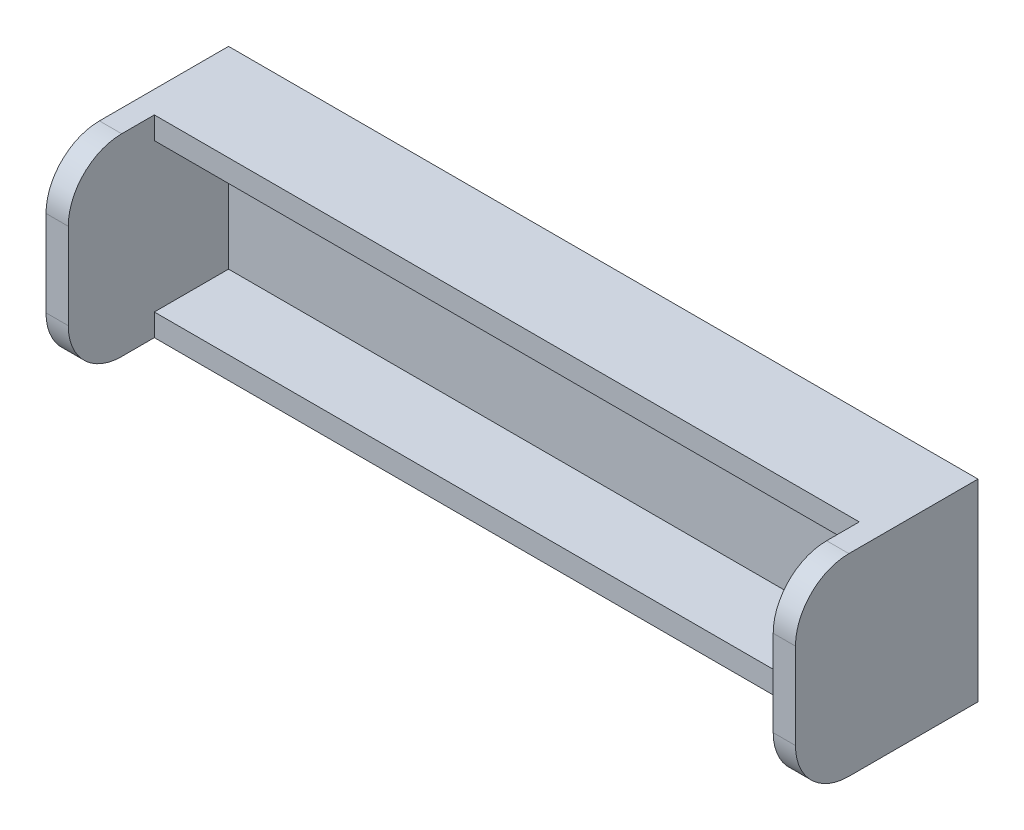
ISO-10303-21;
HEADER;
FILE_DESCRIPTION(('STEP AP214'),'2;1');
FILE_NAME('part.step','',(''),(''),'','','');
FILE_SCHEMA(('AUTOMOTIVE_DESIGN { 1 0 10303 214 1 1 1 1 }'));
ENDSEC;
DATA;
#1=APPLICATION_CONTEXT('core data for automotive mechanical design processes');
#2=APPLICATION_PROTOCOL_DEFINITION('international standard','automotive_design',2000,#1);
#3=PRODUCT_CONTEXT('',#1,'mechanical');
#4=PRODUCT('Part','Part','',(#3));
#5=PRODUCT_RELATED_PRODUCT_CATEGORY('part','',(#4));
#6=PRODUCT_DEFINITION_FORMATION('','',#4);
#7=PRODUCT_DEFINITION_CONTEXT('part definition',#1,'design');
#8=PRODUCT_DEFINITION('design','',#6,#7);
#9=PRODUCT_DEFINITION_SHAPE('','',#8);
#10=(LENGTH_UNIT() NAMED_UNIT(*) SI_UNIT(.MILLI.,.METRE.));
#11=(NAMED_UNIT(*) PLANE_ANGLE_UNIT() SI_UNIT($,.RADIAN.));
#12=(NAMED_UNIT(*) SI_UNIT($,.STERADIAN.) SOLID_ANGLE_UNIT());
#13=UNCERTAINTY_MEASURE_WITH_UNIT(LENGTH_MEASURE(1.E-05),#10,'distance_accuracy_value','');
#14=(GEOMETRIC_REPRESENTATION_CONTEXT(3) GLOBAL_UNCERTAINTY_ASSIGNED_CONTEXT((#13)) GLOBAL_UNIT_ASSIGNED_CONTEXT((#10,
#11,#12)) REPRESENTATION_CONTEXT('',''));
#15=CARTESIAN_POINT('',(0.,0.,0.));
#16=DIRECTION('',(0.,0.,1.));
#17=DIRECTION('',(1.,0.,0.));
#18=AXIS2_PLACEMENT_3D('',#15,#16,#17);
#19=CARTESIAN_POINT('',(0.,0.,1.5));
#20=DIRECTION('',(0.,0.,1.));
#21=DIRECTION('',(1.,0.,0.));
#22=AXIS2_PLACEMENT_3D('',#19,#20,#21);
#23=PLANE('',#22);
#24=DIRECTION('',(0.,1.,0.));
#25=VECTOR('',#24,1.);
#26=CARTESIAN_POINT('',(49.,0.,1.5));
#27=LINE('',#26,#25);
#28=CARTESIAN_POINT('',(49.,-5.,1.5));
#29=VERTEX_POINT('',#28);
#30=CARTESIAN_POINT('',(49.,5.,1.5));
#31=VERTEX_POINT('',#30);
#32=EDGE_CURVE('E206',#29,#31,#27,.T.);
#33=ORIENTED_EDGE('',*,*,#32,.T.);
#34=DIRECTION('',(-1.,0.,0.));
#35=VECTOR('',#34,1.);
#36=CARTESIAN_POINT('',(0.,5.,1.5));
#37=LINE('',#36,#35);
#38=CARTESIAN_POINT('',(1.5,5.,1.5));
#39=VERTEX_POINT('',#38);
#40=EDGE_CURVE('E217',#31,#39,#37,.T.);
#41=ORIENTED_EDGE('',*,*,#40,.T.);
#42=DIRECTION('',(0.,-1.,0.));
#43=VECTOR('',#42,1.);
#44=CARTESIAN_POINT('',(1.5,2.9,1.5));
#45=LINE('',#44,#43);
#46=CARTESIAN_POINT('',(1.5,-5.,1.5));
#47=VERTEX_POINT('',#46);
#48=EDGE_CURVE('E176',#39,#47,#45,.T.);
#49=ORIENTED_EDGE('',*,*,#48,.T.);
#50=DIRECTION('',(1.,0.,0.));
#51=VECTOR('',#50,1.);
#52=CARTESIAN_POINT('',(0.,-5.,1.5));
#53=LINE('',#52,#51);
#54=EDGE_CURVE('E267',#47,#29,#53,.T.);
#55=ORIENTED_EDGE('',*,*,#54,.T.);
#56=EDGE_LOOP('',(#33,#41,#49,#55));
#57=FACE_BOUND('',#56,.T.);
#58=ADVANCED_FACE('F32',(#57),#23,.T.);
#59=CARTESIAN_POINT('',(1.5,2.9,8.69999999999999));
#60=DIRECTION('',(1.,0.,0.));
#61=DIRECTION('',(0.,0.,-1.));
#62=AXIS2_PLACEMENT_3D('',#59,#60,#61);
#63=PLANE('',#62);
#64=DIRECTION('',(0.,0.,1.));
#65=VECTOR('',#64,1.);
#66=CARTESIAN_POINT('',(1.5,5.,8.69999999999999));
#67=LINE('',#66,#65);
#68=CARTESIAN_POINT('',(1.5,5.,6.5));
#69=VERTEX_POINT('',#68);
#70=EDGE_CURVE('E163',#39,#69,#67,.T.);
#71=ORIENTED_EDGE('',*,*,#70,.T.);
#72=DIRECTION('',(0.,1.,0.));
#73=VECTOR('',#72,1.);
#74=CARTESIAN_POINT('',(1.5,2.9,6.5));
#75=LINE('',#74,#73);
#76=CARTESIAN_POINT('',(1.5,6.5,6.5));
#77=VERTEX_POINT('',#76);
#78=EDGE_CURVE('E154',#69,#77,#75,.T.);
#79=ORIENTED_EDGE('',*,*,#78,.T.);
#80=DIRECTION('',(0.,0.,1.));
#81=VECTOR('',#80,1.);
#82=CARTESIAN_POINT('',(1.5,6.5,0.));
#83=LINE('',#82,#81);
#84=CARTESIAN_POINT('',(1.5,6.5,8.69999999999999));
#85=VERTEX_POINT('',#84);
#86=EDGE_CURVE('E89',#77,#85,#83,.T.);
#87=ORIENTED_EDGE('',*,*,#86,.T.);
#88=CARTESIAN_POINT('',(1.5,2.9,8.69999999999999));
#89=DIRECTION('',(1.,0.,0.));
#90=DIRECTION('',(0.,0.,-1.));
#91=AXIS2_PLACEMENT_3D('',#88,#89,#90);
#92=CIRCLE('',#91,3.6);
#93=CARTESIAN_POINT('',(1.5,2.89999999999999,12.3));
#94=VERTEX_POINT('',#93);
#95=EDGE_CURVE('E169',#85,#94,#92,.T.);
#96=ORIENTED_EDGE('',*,*,#95,.T.);
#97=DIRECTION('',(0.,-1.,0.));
#98=VECTOR('',#97,1.);
#99=CARTESIAN_POINT('',(1.5,-2.9,12.3));
#100=LINE('',#99,#98);
#101=CARTESIAN_POINT('',(1.5,-2.9,12.3));
#102=VERTEX_POINT('',#101);
#103=EDGE_CURVE('E171',#94,#102,#100,.T.);
#104=ORIENTED_EDGE('',*,*,#103,.T.);
#105=CARTESIAN_POINT('',(1.5,-2.9,8.69999999999999));
#106=DIRECTION('',(1.,0.,0.));
#107=DIRECTION('',(0.,0.,1.));
#108=AXIS2_PLACEMENT_3D('',#105,#106,#107);
#109=CIRCLE('',#108,3.6);
#110=CARTESIAN_POINT('',(1.5,-6.5,8.69999999999999));
#111=VERTEX_POINT('',#110);
#112=EDGE_CURVE('E55',#102,#111,#109,.T.);
#113=ORIENTED_EDGE('',*,*,#112,.T.);
#114=DIRECTION('',(0.,0.,-1.));
#115=VECTOR('',#114,1.);
#116=CARTESIAN_POINT('',(1.5,-6.5,0.));
#117=LINE('',#116,#115);
#118=CARTESIAN_POINT('',(1.5,-6.5,6.5));
#119=VERTEX_POINT('',#118);
#120=EDGE_CURVE('E181',#111,#119,#117,.T.);
#121=ORIENTED_EDGE('',*,*,#120,.T.);
#122=DIRECTION('',(0.,-1.,0.));
#123=VECTOR('',#122,1.);
#124=CARTESIAN_POINT('',(1.5,2.9,6.5));
#125=LINE('',#124,#123);
#126=CARTESIAN_POINT('',(1.5,-5.,6.5));
#127=VERTEX_POINT('',#126);
#128=EDGE_CURVE('E228',#127,#119,#125,.T.);
#129=ORIENTED_EDGE('',*,*,#128,.F.);
#130=DIRECTION('',(0.,0.,-1.));
#131=VECTOR('',#130,1.);
#132=CARTESIAN_POINT('',(1.5,-5.,8.69999999999999));
#133=LINE('',#132,#131);
#134=EDGE_CURVE('E232',#127,#47,#133,.T.);
#135=ORIENTED_EDGE('',*,*,#134,.T.);
#136=ORIENTED_EDGE('',*,*,#48,.F.);
#137=EDGE_LOOP('',(#71,#79,#87,#96,#104,#113,#121,#129,#135,#136));
#138=FACE_BOUND('',#137,.T.);
#139=ADVANCED_FACE('F161',(#138),#63,.T.);
#140=CARTESIAN_POINT('',(49.,2.9,8.69999999999999));
#141=DIRECTION('',(1.,0.,0.));
#142=DIRECTION('',(0.,0.,-1.));
#143=AXIS2_PLACEMENT_3D('',#140,#141,#142);
#144=PLANE('',#143);
#145=DIRECTION('',(0.,1.,0.));
#146=VECTOR('',#145,1.);
#147=CARTESIAN_POINT('',(49.,2.9,6.5));
#148=LINE('',#147,#146);
#149=CARTESIAN_POINT('',(49.,5.,6.5));
#150=VERTEX_POINT('',#149);
#151=CARTESIAN_POINT('',(49.,6.5,6.5));
#152=VERTEX_POINT('',#151);
#153=EDGE_CURVE('E11',#150,#152,#148,.T.);
#154=ORIENTED_EDGE('',*,*,#153,.F.);
#155=DIRECTION('',(0.,0.,1.));
#156=VECTOR('',#155,1.);
#157=CARTESIAN_POINT('',(49.,5.,8.69999999999999));
#158=LINE('',#157,#156);
#159=EDGE_CURVE('E40',#31,#150,#158,.T.);
#160=ORIENTED_EDGE('',*,*,#159,.F.);
#161=ORIENTED_EDGE('',*,*,#32,.F.);
#162=DIRECTION('',(0.,0.,-1.));
#163=VECTOR('',#162,1.);
#164=CARTESIAN_POINT('',(49.,-5.,8.69999999999999));
#165=LINE('',#164,#163);
#166=CARTESIAN_POINT('',(49.,-5.,6.5));
#167=VERTEX_POINT('',#166);
#168=EDGE_CURVE('E209',#167,#29,#165,.T.);
#169=ORIENTED_EDGE('',*,*,#168,.F.);
#170=DIRECTION('',(0.,-1.,0.));
#171=VECTOR('',#170,1.);
#172=CARTESIAN_POINT('',(49.,2.9,6.5));
#173=LINE('',#172,#171);
#174=CARTESIAN_POINT('',(49.,-6.5,6.5));
#175=VERTEX_POINT('',#174);
#176=EDGE_CURVE('E211',#167,#175,#173,.T.);
#177=ORIENTED_EDGE('',*,*,#176,.T.);
#178=DIRECTION('',(0.,0.,-1.));
#179=VECTOR('',#178,1.);
#180=CARTESIAN_POINT('',(49.,-6.5,0.));
#181=LINE('',#180,#179);
#182=CARTESIAN_POINT('',(49.,-6.5,8.69999999999999));
#183=VERTEX_POINT('',#182);
#184=EDGE_CURVE('E241',#183,#175,#181,.T.);
#185=ORIENTED_EDGE('',*,*,#184,.F.);
#186=CARTESIAN_POINT('',(49.,-2.9,8.69999999999999));
#187=DIRECTION('',(1.,0.,0.));
#188=DIRECTION('',(0.,0.,1.));
#189=AXIS2_PLACEMENT_3D('',#186,#187,#188);
#190=CIRCLE('',#189,3.6);
#191=CARTESIAN_POINT('',(49.,-2.9,12.3));
#192=VERTEX_POINT('',#191);
#193=EDGE_CURVE('E239',#192,#183,#190,.T.);
#194=ORIENTED_EDGE('',*,*,#193,.F.);
#195=DIRECTION('',(0.,-1.,0.));
#196=VECTOR('',#195,1.);
#197=CARTESIAN_POINT('',(49.,-2.9,12.3));
#198=LINE('',#197,#196);
#199=CARTESIAN_POINT('',(49.,2.89999999999999,12.3));
#200=VERTEX_POINT('',#199);
#201=EDGE_CURVE('E230',#200,#192,#198,.T.);
#202=ORIENTED_EDGE('',*,*,#201,.F.);
#203=CARTESIAN_POINT('',(49.,2.9,8.69999999999999));
#204=DIRECTION('',(1.,0.,0.));
#205=DIRECTION('',(0.,0.,-1.));
#206=AXIS2_PLACEMENT_3D('',#203,#204,#205);
#207=CIRCLE('',#206,3.6);
#208=CARTESIAN_POINT('',(49.,6.5,8.69999999999999));
#209=VERTEX_POINT('',#208);
#210=EDGE_CURVE('E225',#209,#200,#207,.T.);
#211=ORIENTED_EDGE('',*,*,#210,.F.);
#212=DIRECTION('',(0.,0.,1.));
#213=VECTOR('',#212,1.);
#214=CARTESIAN_POINT('',(49.,6.5,0.));
#215=LINE('',#214,#213);
#216=EDGE_CURVE('E223',#152,#209,#215,.T.);
#217=ORIENTED_EDGE('',*,*,#216,.F.);
#218=EDGE_LOOP('',(#154,#160,#161,#169,#177,#185,#194,#202,#211,#217));
#219=FACE_BOUND('',#218,.T.);
#220=ADVANCED_FACE('F221',(#219),#144,.F.);
#221=CARTESIAN_POINT('',(1.5,6.5,0.));
#222=DIRECTION('',(0.,-1.,0.));
#223=DIRECTION('',(0.,0.,-1.));
#224=AXIS2_PLACEMENT_3D('',#221,#222,#223);
#225=PLANE('',#224);
#226=DIRECTION('',(0.,0.,1.));
#227=VECTOR('',#226,1.);
#228=CARTESIAN_POINT('',(0.,6.5,0.));
#229=LINE('',#228,#227);
#230=CARTESIAN_POINT('',(0.,6.5,0.));
#231=VERTEX_POINT('',#230);
#232=CARTESIAN_POINT('',(0.,6.5,8.69999999999999));
#233=VERTEX_POINT('',#232);
#234=EDGE_CURVE('E184',#231,#233,#229,.T.);
#235=ORIENTED_EDGE('',*,*,#234,.T.);
#236=DIRECTION('',(-1.,0.,0.));
#237=VECTOR('',#236,1.);
#238=CARTESIAN_POINT('',(1.5,6.5,8.69999999999999));
#239=LINE('',#238,#237);
#240=EDGE_CURVE('E168',#85,#233,#239,.T.);
#241=ORIENTED_EDGE('',*,*,#240,.F.);
#242=ORIENTED_EDGE('',*,*,#86,.F.);
#243=DIRECTION('',(-1.,0.,0.));
#244=VECTOR('',#243,1.);
#245=CARTESIAN_POINT('',(0.,6.5,6.5));
#246=LINE('',#245,#244);
#247=EDGE_CURVE('E47',#152,#77,#246,.T.);
#248=ORIENTED_EDGE('',*,*,#247,.F.);
#249=ORIENTED_EDGE('',*,*,#216,.T.);
#250=DIRECTION('',(-1.,0.,0.));
#251=VECTOR('',#250,1.);
#252=CARTESIAN_POINT('',(50.5,6.5,8.69999999999999));
#253=LINE('',#252,#251);
#254=CARTESIAN_POINT('',(50.5,6.5,8.69999999999999));
#255=VERTEX_POINT('',#254);
#256=EDGE_CURVE('E254',#255,#209,#253,.T.);
#257=ORIENTED_EDGE('',*,*,#256,.F.);
#258=DIRECTION('',(0.,0.,-1.));
#259=VECTOR('',#258,1.);
#260=CARTESIAN_POINT('',(50.5,6.5,1.5));
#261=LINE('',#260,#259);
#262=CARTESIAN_POINT('',(50.5,6.5,0.));
#263=VERTEX_POINT('',#262);
#264=EDGE_CURVE('E258',#255,#263,#261,.T.);
#265=ORIENTED_EDGE('',*,*,#264,.T.);
#266=DIRECTION('',(-1.,0.,0.));
#267=VECTOR('',#266,1.);
#268=CARTESIAN_POINT('',(1.5,6.5,0.));
#269=LINE('',#268,#267);
#270=EDGE_CURVE('E183',#263,#231,#269,.T.);
#271=ORIENTED_EDGE('',*,*,#270,.T.);
#272=EDGE_LOOP('',(#235,#241,#242,#248,#249,#257,#265,#271));
#273=FACE_BOUND('',#272,.T.);
#274=ADVANCED_FACE('F34',(#273),#225,.F.);
#275=CARTESIAN_POINT('',(1.5,2.9,8.69999999999999));
#276=DIRECTION('',(-1.,0.,0.));
#277=DIRECTION('',(0.,0.,1.));
#278=AXIS2_PLACEMENT_3D('',#275,#276,#277);
#279=CYLINDRICAL_SURFACE('',#278,3.6);
#280=CARTESIAN_POINT('',(0.,2.9,8.69999999999999));
#281=DIRECTION('',(1.,0.,0.));
#282=DIRECTION('',(0.,0.,-1.));
#283=AXIS2_PLACEMENT_3D('',#280,#281,#282);
#284=CIRCLE('',#283,3.6);
#285=CARTESIAN_POINT('',(0.,2.89999999999999,12.3));
#286=VERTEX_POINT('',#285);
#287=EDGE_CURVE('E186',#233,#286,#284,.T.);
#288=ORIENTED_EDGE('',*,*,#287,.T.);
#289=DIRECTION('',(-1.,0.,0.));
#290=VECTOR('',#289,1.);
#291=CARTESIAN_POINT('',(1.5,2.89999999999999,12.3));
#292=LINE('',#291,#290);
#293=EDGE_CURVE('E202',#94,#286,#292,.T.);
#294=ORIENTED_EDGE('',*,*,#293,.F.);
#295=ORIENTED_EDGE('',*,*,#95,.F.);
#296=ORIENTED_EDGE('',*,*,#240,.T.);
#297=EDGE_LOOP('',(#288,#294,#295,#296));
#298=FACE_BOUND('',#297,.T.);
#299=ADVANCED_FACE('F343',(#298),#279,.T.);
#300=CARTESIAN_POINT('',(1.5,-2.9,12.3));
#301=DIRECTION('',(0.,0.,-1.));
#302=DIRECTION('',(-1.,0.,0.));
#303=AXIS2_PLACEMENT_3D('',#300,#301,#302);
#304=PLANE('',#303);
#305=DIRECTION('',(0.,-1.,0.));
#306=VECTOR('',#305,1.);
#307=CARTESIAN_POINT('',(0.,-2.9,12.3));
#308=LINE('',#307,#306);
#309=CARTESIAN_POINT('',(0.,-2.9,12.3));
#310=VERTEX_POINT('',#309);
#311=EDGE_CURVE('E188',#286,#310,#308,.T.);
#312=ORIENTED_EDGE('',*,*,#311,.T.);
#313=DIRECTION('',(-1.,0.,0.));
#314=VECTOR('',#313,1.);
#315=CARTESIAN_POINT('',(1.5,-2.9,12.3));
#316=LINE('',#315,#314);
#317=EDGE_CURVE('E199',#102,#310,#316,.T.);
#318=ORIENTED_EDGE('',*,*,#317,.F.);
#319=ORIENTED_EDGE('',*,*,#103,.F.);
#320=ORIENTED_EDGE('',*,*,#293,.T.);
#321=EDGE_LOOP('',(#312,#318,#319,#320));
#322=FACE_BOUND('',#321,.T.);
#323=ADVANCED_FACE('F341',(#322),#304,.F.);
#324=CARTESIAN_POINT('',(1.5,-2.9,8.69999999999999));
#325=DIRECTION('',(-1.,0.,0.));
#326=DIRECTION('',(0.,0.,1.));
#327=AXIS2_PLACEMENT_3D('',#324,#325,#326);
#328=CYLINDRICAL_SURFACE('',#327,3.6);
#329=CARTESIAN_POINT('',(0.,-2.9,8.69999999999999));
#330=DIRECTION('',(1.,0.,0.));
#331=DIRECTION('',(0.,0.,1.));
#332=AXIS2_PLACEMENT_3D('',#329,#330,#331);
#333=CIRCLE('',#332,3.6);
#334=CARTESIAN_POINT('',(0.,-6.5,8.69999999999999));
#335=VERTEX_POINT('',#334);
#336=EDGE_CURVE('E190',#310,#335,#333,.T.);
#337=ORIENTED_EDGE('',*,*,#336,.T.);
#338=DIRECTION('',(-1.,0.,0.));
#339=VECTOR('',#338,1.);
#340=CARTESIAN_POINT('',(1.5,-6.5,8.69999999999999));
#341=LINE('',#340,#339);
#342=EDGE_CURVE('E196',#111,#335,#341,.T.);
#343=ORIENTED_EDGE('',*,*,#342,.F.);
#344=ORIENTED_EDGE('',*,*,#112,.F.);
#345=ORIENTED_EDGE('',*,*,#317,.T.);
#346=EDGE_LOOP('',(#337,#343,#344,#345));
#347=FACE_BOUND('',#346,.T.);
#348=ADVANCED_FACE('F338',(#347),#328,.T.);
#349=CARTESIAN_POINT('',(1.5,-6.5,0.));
#350=DIRECTION('',(0.,1.,0.));
#351=DIRECTION('',(0.,0.,1.));
#352=AXIS2_PLACEMENT_3D('',#349,#350,#351);
#353=PLANE('',#352);
#354=ORIENTED_EDGE('',*,*,#184,.T.);
#355=DIRECTION('',(-1.,0.,0.));
#356=VECTOR('',#355,1.);
#357=CARTESIAN_POINT('',(0.,-6.5,6.5));
#358=LINE('',#357,#356);
#359=EDGE_CURVE('E164',#175,#119,#358,.T.);
#360=ORIENTED_EDGE('',*,*,#359,.T.);
#361=ORIENTED_EDGE('',*,*,#120,.F.);
#362=ORIENTED_EDGE('',*,*,#342,.T.);
#363=DIRECTION('',(0.,0.,-1.));
#364=VECTOR('',#363,1.);
#365=CARTESIAN_POINT('',(0.,-6.5,0.));
#366=LINE('',#365,#364);
#367=CARTESIAN_POINT('',(0.,-6.5,0.));
#368=VERTEX_POINT('',#367);
#369=EDGE_CURVE('E173',#335,#368,#366,.T.);
#370=ORIENTED_EDGE('',*,*,#369,.T.);
#371=DIRECTION('',(-1.,0.,0.));
#372=VECTOR('',#371,1.);
#373=CARTESIAN_POINT('',(1.5,-6.5,0.));
#374=LINE('',#373,#372);
#375=CARTESIAN_POINT('',(50.5,-6.5,0.));
#376=VERTEX_POINT('',#375);
#377=EDGE_CURVE('E194',#376,#368,#374,.T.);
#378=ORIENTED_EDGE('',*,*,#377,.F.);
#379=DIRECTION('',(0.,0.,-1.));
#380=VECTOR('',#379,1.);
#381=CARTESIAN_POINT('',(50.5,-6.5,1.5));
#382=LINE('',#381,#380);
#383=CARTESIAN_POINT('',(50.5,-6.5,8.69999999999999));
#384=VERTEX_POINT('',#383);
#385=EDGE_CURVE('E260',#384,#376,#382,.T.);
#386=ORIENTED_EDGE('',*,*,#385,.F.);
#387=DIRECTION('',(-1.,0.,0.));
#388=VECTOR('',#387,1.);
#389=CARTESIAN_POINT('',(50.5,-6.5,8.69999999999999));
#390=LINE('',#389,#388);
#391=EDGE_CURVE('E245',#384,#183,#390,.T.);
#392=ORIENTED_EDGE('',*,*,#391,.T.);
#393=EDGE_LOOP('',(#354,#360,#361,#362,#370,#378,#386,#392));
#394=FACE_BOUND('',#393,.T.);
#395=ADVANCED_FACE('F291',(#394),#353,.F.);
#396=CARTESIAN_POINT('',(1.5,6.5,0.));
#397=DIRECTION('',(0.,0.,1.));
#398=DIRECTION('',(0.,-1.,0.));
#399=AXIS2_PLACEMENT_3D('',#396,#397,#398);
#400=PLANE('',#399);
#401=ORIENTED_EDGE('',*,*,#270,.F.);
#402=DIRECTION('',(0.,1.,0.));
#403=VECTOR('',#402,1.);
#404=CARTESIAN_POINT('',(50.5,6.5,0.));
#405=LINE('',#404,#403);
#406=EDGE_CURVE('E256',#376,#263,#405,.T.);
#407=ORIENTED_EDGE('',*,*,#406,.F.);
#408=ORIENTED_EDGE('',*,*,#377,.T.);
#409=DIRECTION('',(0.,1.,0.));
#410=VECTOR('',#409,1.);
#411=CARTESIAN_POINT('',(0.,6.5,0.));
#412=LINE('',#411,#410);
#413=EDGE_CURVE('E83',#368,#231,#412,.T.);
#414=ORIENTED_EDGE('',*,*,#413,.T.);
#415=EDGE_LOOP('',(#401,#407,#408,#414));
#416=FACE_BOUND('',#415,.T.);
#417=ADVANCED_FACE('F308',(#416),#400,.F.);
#418=CARTESIAN_POINT('',(0.,2.9,8.69999999999999));
#419=DIRECTION('',(1.,0.,0.));
#420=DIRECTION('',(0.,0.,-1.));
#421=AXIS2_PLACEMENT_3D('',#418,#419,#420);
#422=PLANE('',#421);
#423=ORIENTED_EDGE('',*,*,#287,.F.);
#424=ORIENTED_EDGE('',*,*,#234,.F.);
#425=ORIENTED_EDGE('',*,*,#413,.F.);
#426=ORIENTED_EDGE('',*,*,#369,.F.);
#427=ORIENTED_EDGE('',*,*,#336,.F.);
#428=ORIENTED_EDGE('',*,*,#311,.F.);
#429=EDGE_LOOP('',(#423,#424,#425,#426,#427,#428));
#430=FACE_BOUND('',#429,.T.);
#431=ADVANCED_FACE('F304',(#430),#422,.F.);
#432=CARTESIAN_POINT('',(50.5,6.5,1.5));
#433=DIRECTION('',(-1.,0.,0.));
#434=DIRECTION('',(0.,0.,1.));
#435=AXIS2_PLACEMENT_3D('',#432,#433,#434);
#436=PLANE('',#435);
#437=ORIENTED_EDGE('',*,*,#406,.T.);
#438=ORIENTED_EDGE('',*,*,#264,.F.);
#439=CARTESIAN_POINT('',(50.5,2.9,8.69999999999999));
#440=DIRECTION('',(1.,0.,0.));
#441=DIRECTION('',(0.,0.,-1.));
#442=AXIS2_PLACEMENT_3D('',#439,#440,#441);
#443=CIRCLE('',#442,3.6);
#444=CARTESIAN_POINT('',(50.5,2.89999999999999,12.3));
#445=VERTEX_POINT('',#444);
#446=EDGE_CURVE('E244',#255,#445,#443,.T.);
#447=ORIENTED_EDGE('',*,*,#446,.T.);
#448=DIRECTION('',(0.,-1.,0.));
#449=VECTOR('',#448,1.);
#450=CARTESIAN_POINT('',(50.5,-2.9,12.3));
#451=LINE('',#450,#449);
#452=CARTESIAN_POINT('',(50.5,-2.9,12.3));
#453=VERTEX_POINT('',#452);
#454=EDGE_CURVE('E280',#445,#453,#451,.T.);
#455=ORIENTED_EDGE('',*,*,#454,.T.);
#456=CARTESIAN_POINT('',(50.5,-2.9,8.69999999999999));
#457=DIRECTION('',(1.,0.,0.));
#458=DIRECTION('',(0.,0.,1.));
#459=AXIS2_PLACEMENT_3D('',#456,#457,#458);
#460=CIRCLE('',#459,3.6);
#461=EDGE_CURVE('E235',#453,#384,#460,.T.);
#462=ORIENTED_EDGE('',*,*,#461,.T.);
#463=ORIENTED_EDGE('',*,*,#385,.T.);
#464=EDGE_LOOP('',(#437,#438,#447,#455,#462,#463));
#465=FACE_BOUND('',#464,.T.);
#466=ADVANCED_FACE('F285',(#465),#436,.F.);
#467=CARTESIAN_POINT('',(50.5,2.9,8.69999999999999));
#468=DIRECTION('',(-1.,0.,0.));
#469=DIRECTION('',(0.,0.,1.));
#470=AXIS2_PLACEMENT_3D('',#467,#468,#469);
#471=CYLINDRICAL_SURFACE('',#470,3.6);
#472=ORIENTED_EDGE('',*,*,#210,.T.);
#473=DIRECTION('',(-1.,0.,0.));
#474=VECTOR('',#473,1.);
#475=CARTESIAN_POINT('',(50.5,2.89999999999999,12.3));
#476=LINE('',#475,#474);
#477=EDGE_CURVE('E251',#445,#200,#476,.T.);
#478=ORIENTED_EDGE('',*,*,#477,.F.);
#479=ORIENTED_EDGE('',*,*,#446,.F.);
#480=ORIENTED_EDGE('',*,*,#256,.T.);
#481=EDGE_LOOP('',(#472,#478,#479,#480));
#482=FACE_BOUND('',#481,.T.);
#483=ADVANCED_FACE('F312',(#482),#471,.T.);
#484=CARTESIAN_POINT('',(50.5,-2.9,12.3));
#485=DIRECTION('',(0.,0.,-1.));
#486=DIRECTION('',(-1.,0.,0.));
#487=AXIS2_PLACEMENT_3D('',#484,#485,#486);
#488=PLANE('',#487);
#489=ORIENTED_EDGE('',*,*,#201,.T.);
#490=DIRECTION('',(-1.,0.,0.));
#491=VECTOR('',#490,1.);
#492=CARTESIAN_POINT('',(50.5,-2.9,12.3));
#493=LINE('',#492,#491);
#494=EDGE_CURVE('E248',#453,#192,#493,.T.);
#495=ORIENTED_EDGE('',*,*,#494,.F.);
#496=ORIENTED_EDGE('',*,*,#454,.F.);
#497=ORIENTED_EDGE('',*,*,#477,.T.);
#498=EDGE_LOOP('',(#489,#495,#496,#497));
#499=FACE_BOUND('',#498,.T.);
#500=ADVANCED_FACE('F314',(#499),#488,.F.);
#501=CARTESIAN_POINT('',(50.5,-2.9,8.69999999999999));
#502=DIRECTION('',(-1.,0.,0.));
#503=DIRECTION('',(0.,0.,1.));
#504=AXIS2_PLACEMENT_3D('',#501,#502,#503);
#505=CYLINDRICAL_SURFACE('',#504,3.6);
#506=ORIENTED_EDGE('',*,*,#193,.T.);
#507=ORIENTED_EDGE('',*,*,#391,.F.);
#508=ORIENTED_EDGE('',*,*,#461,.F.);
#509=ORIENTED_EDGE('',*,*,#494,.T.);
#510=EDGE_LOOP('',(#506,#507,#508,#509));
#511=FACE_BOUND('',#510,.T.);
#512=ADVANCED_FACE('F287',(#511),#505,.T.);
#513=CARTESIAN_POINT('',(0.,-5.,6.5));
#514=DIRECTION('',(0.,0.,1.));
#515=DIRECTION('',(0.,-1.,0.));
#516=AXIS2_PLACEMENT_3D('',#513,#514,#515);
#517=PLANE('',#516);
#518=DIRECTION('',(-1.,0.,0.));
#519=VECTOR('',#518,1.);
#520=CARTESIAN_POINT('',(0.,-5.,6.5));
#521=LINE('',#520,#519);
#522=EDGE_CURVE('E274',#167,#127,#521,.T.);
#523=ORIENTED_EDGE('',*,*,#522,.T.);
#524=ORIENTED_EDGE('',*,*,#128,.T.);
#525=ORIENTED_EDGE('',*,*,#359,.F.);
#526=ORIENTED_EDGE('',*,*,#176,.F.);
#527=EDGE_LOOP('',(#523,#524,#525,#526));
#528=FACE_BOUND('',#527,.T.);
#529=ADVANCED_FACE('F294',(#528),#517,.T.);
#530=CARTESIAN_POINT('',(0.,-5.,0.));
#531=DIRECTION('',(0.,-1.,0.));
#532=DIRECTION('',(0.,0.,-1.));
#533=AXIS2_PLACEMENT_3D('',#530,#531,#532);
#534=PLANE('',#533);
#535=ORIENTED_EDGE('',*,*,#134,.F.);
#536=ORIENTED_EDGE('',*,*,#522,.F.);
#537=ORIENTED_EDGE('',*,*,#168,.T.);
#538=ORIENTED_EDGE('',*,*,#54,.F.);
#539=EDGE_LOOP('',(#535,#536,#537,#538));
#540=FACE_BOUND('',#539,.T.);
#541=ADVANCED_FACE('F270',(#540),#534,.F.);
#542=CARTESIAN_POINT('',(0.,5.,6.5));
#543=DIRECTION('',(0.,0.,-1.));
#544=DIRECTION('',(0.,1.,0.));
#545=AXIS2_PLACEMENT_3D('',#542,#543,#544);
#546=PLANE('',#545);
#547=ORIENTED_EDGE('',*,*,#78,.F.);
#548=DIRECTION('',(-1.,0.,0.));
#549=VECTOR('',#548,1.);
#550=CARTESIAN_POINT('',(0.,5.,6.5));
#551=LINE('',#550,#549);
#552=EDGE_CURVE('E158',#150,#69,#551,.T.);
#553=ORIENTED_EDGE('',*,*,#552,.F.);
#554=ORIENTED_EDGE('',*,*,#153,.T.);
#555=ORIENTED_EDGE('',*,*,#247,.T.);
#556=EDGE_LOOP('',(#547,#553,#554,#555));
#557=FACE_BOUND('',#556,.T.);
#558=ADVANCED_FACE('F152',(#557),#546,.F.);
#559=CARTESIAN_POINT('',(0.,5.,0.));
#560=DIRECTION('',(0.,1.,0.));
#561=DIRECTION('',(0.,0.,-1.));
#562=AXIS2_PLACEMENT_3D('',#559,#560,#561);
#563=PLANE('',#562);
#564=ORIENTED_EDGE('',*,*,#70,.F.);
#565=ORIENTED_EDGE('',*,*,#40,.F.);
#566=ORIENTED_EDGE('',*,*,#159,.T.);
#567=ORIENTED_EDGE('',*,*,#552,.T.);
#568=EDGE_LOOP('',(#564,#565,#566,#567));
#569=FACE_BOUND('',#568,.T.);
#570=ADVANCED_FACE('F215',(#569),#563,.F.);
#571=CLOSED_SHELL('',(#58,#139,#220,#274,#299,#323,#348,#395,#417,#431,#466,#483,#500,#512,#529,
#541,#558,#570));
#572=MANIFOLD_SOLID_BREP('B2',#571);
#573=ADVANCED_BREP_SHAPE_REPRESENTATION('',(#18,#572),#14);
#574=SHAPE_DEFINITION_REPRESENTATION(#9,#573);
ENDSEC;
END-ISO-10303-21;
